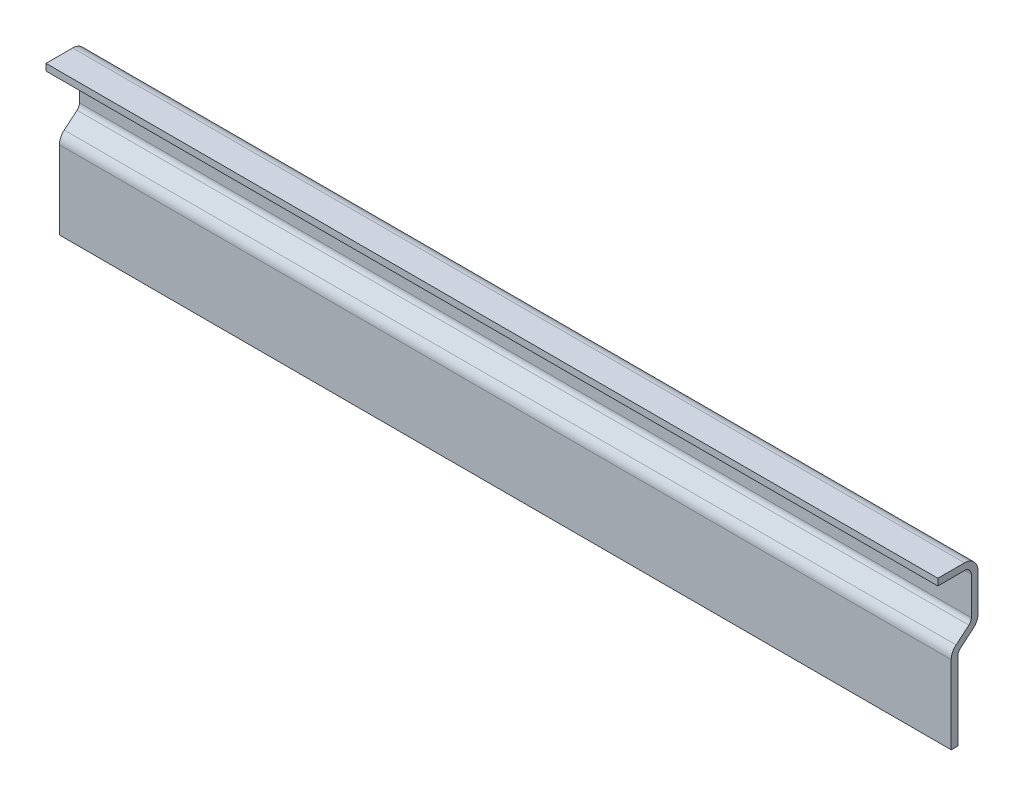
ISO-10303-21;
HEADER;
FILE_DESCRIPTION(('STEP AP214'),'2;1');
FILE_NAME('part.step','',(''),(''),'','','');
FILE_SCHEMA(('AUTOMOTIVE_DESIGN { 1 0 10303 214 1 1 1 1 }'));
ENDSEC;
DATA;
#1=APPLICATION_CONTEXT('core data for automotive mechanical design processes');
#2=APPLICATION_PROTOCOL_DEFINITION('international standard','automotive_design',2000,#1);
#3=PRODUCT_CONTEXT('',#1,'mechanical');
#4=PRODUCT('Part','Part','',(#3));
#5=PRODUCT_RELATED_PRODUCT_CATEGORY('part','',(#4));
#6=PRODUCT_DEFINITION_FORMATION('','',#4);
#7=PRODUCT_DEFINITION_CONTEXT('part definition',#1,'design');
#8=PRODUCT_DEFINITION('design','',#6,#7);
#9=PRODUCT_DEFINITION_SHAPE('','',#8);
#10=(LENGTH_UNIT() NAMED_UNIT(*) SI_UNIT(.MILLI.,.METRE.));
#11=(NAMED_UNIT(*) PLANE_ANGLE_UNIT() SI_UNIT($,.RADIAN.));
#12=(NAMED_UNIT(*) SI_UNIT($,.STERADIAN.) SOLID_ANGLE_UNIT());
#13=UNCERTAINTY_MEASURE_WITH_UNIT(LENGTH_MEASURE(1.E-05),#10,'distance_accuracy_value','');
#14=(GEOMETRIC_REPRESENTATION_CONTEXT(3) GLOBAL_UNCERTAINTY_ASSIGNED_CONTEXT((#13)) GLOBAL_UNIT_ASSIGNED_CONTEXT((#10,
#11,#12)) REPRESENTATION_CONTEXT('',''));
#15=CARTESIAN_POINT('',(0.,0.,0.));
#16=DIRECTION('',(0.,0.,1.));
#17=DIRECTION('',(1.,0.,0.));
#18=AXIS2_PLACEMENT_3D('',#15,#16,#17);
#19=CARTESIAN_POINT('',(-186.,-849.5,215.));
#20=DIRECTION('',(1.,0.,0.));
#21=DIRECTION('',(0.,0.,1.));
#22=AXIS2_PLACEMENT_3D('',#19,#20,#21);
#23=PLANE('',#22);
#24=DIRECTION('',(0.,0.,-1.));
#25=VECTOR('',#24,1.);
#26=CARTESIAN_POINT('',(-186.,-965.5,235.));
#27=LINE('',#26,#25);
#28=CARTESIAN_POINT('',(-186.,-965.5,235.));
#29=VERTEX_POINT('',#28);
#30=CARTESIAN_POINT('',(-186.,-965.5,230.));
#31=VERTEX_POINT('',#30);
#32=EDGE_CURVE('E100',#29,#31,#27,.T.);
#33=ORIENTED_EDGE('',*,*,#32,.F.);
#34=DIRECTION('',(0.,-1.,0.));
#35=VECTOR('',#34,1.);
#36=CARTESIAN_POINT('',(-186.,-907.17437087162,235.));
#37=LINE('',#36,#35);
#38=CARTESIAN_POINT('',(-186.,-907.17437087162,235.));
#39=VERTEX_POINT('',#38);
#40=EDGE_CURVE('E36',#39,#29,#37,.T.);
#41=ORIENTED_EDGE('',*,*,#40,.F.);
#42=CARTESIAN_POINT('',(-186.,-907.17437087162,224.9));
#43=DIRECTION('',(1.,0.,0.));
#44=DIRECTION('',(0.,0.766044443119007,0.642787609686505));
#45=AXIS2_PLACEMENT_3D('',#42,#43,#44);
#46=CIRCLE('',#45,10.1);
#47=CARTESIAN_POINT('',(-186.,-899.43732199611,231.39215485783));
#48=VERTEX_POINT('',#47);
#49=EDGE_CURVE('E241',#48,#39,#46,.T.);
#50=ORIENTED_EDGE('',*,*,#49,.F.);
#51=DIRECTION('',(0.,-0.642787609686505,0.766044443119007));
#52=VECTOR('',#51,1.);
#53=CARTESIAN_POINT('',(-186.,-891.40682665991,221.821783190599));
#54=LINE('',#53,#52);
#55=CARTESIAN_POINT('',(-186.,-891.40682665991,221.821783190599));
#56=VERTEX_POINT('',#55);
#57=EDGE_CURVE('E142',#56,#48,#54,.T.);
#58=ORIENTED_EDGE('',*,*,#57,.F.);
#59=CARTESIAN_POINT('',(-186.,-887.5,225.1));
#60=DIRECTION('',(-1.,0.,0.));
#61=DIRECTION('',(0.,0.,-1.));
#62=AXIS2_PLACEMENT_3D('',#59,#60,#61);
#63=CIRCLE('',#62,5.1);
#64=CARTESIAN_POINT('',(-186.,-887.5,220.));
#65=VERTEX_POINT('',#64);
#66=EDGE_CURVE('E139',#65,#56,#63,.T.);
#67=ORIENTED_EDGE('',*,*,#66,.F.);
#68=DIRECTION('',(0.,-1.,0.));
#69=VECTOR('',#68,1.);
#70=CARTESIAN_POINT('',(-186.,-859.6,220.));
#71=LINE('',#70,#69);
#72=CARTESIAN_POINT('',(-186.,-859.6,220.));
#73=VERTEX_POINT('',#72);
#74=EDGE_CURVE('E127',#73,#65,#71,.T.);
#75=ORIENTED_EDGE('',*,*,#74,.F.);
#76=CARTESIAN_POINT('',(-186.,-859.6,225.1));
#77=DIRECTION('',(-1.,0.,0.));
#78=DIRECTION('',(0.,1.,0.));
#79=AXIS2_PLACEMENT_3D('',#76,#77,#78);
#80=CIRCLE('',#79,5.1);
#81=CARTESIAN_POINT('',(-186.,-854.5,225.1));
#82=VERTEX_POINT('',#81);
#83=EDGE_CURVE('E207',#82,#73,#80,.T.);
#84=ORIENTED_EDGE('',*,*,#83,.F.);
#85=DIRECTION('',(0.,0.,-1.));
#86=VECTOR('',#85,1.);
#87=CARTESIAN_POINT('',(-186.,-854.5,245.));
#88=LINE('',#87,#86);
#89=CARTESIAN_POINT('',(-186.,-854.5,245.));
#90=VERTEX_POINT('',#89);
#91=EDGE_CURVE('E204',#90,#82,#88,.T.);
#92=ORIENTED_EDGE('',*,*,#91,.F.);
#93=DIRECTION('',(0.,-1.,0.));
#94=VECTOR('',#93,1.);
#95=CARTESIAN_POINT('',(-186.,-849.5,245.));
#96=LINE('',#95,#94);
#97=CARTESIAN_POINT('',(-186.,-849.5,245.));
#98=VERTEX_POINT('',#97);
#99=EDGE_CURVE('E163',#98,#90,#96,.T.);
#100=ORIENTED_EDGE('',*,*,#99,.F.);
#101=DIRECTION('',(0.,0.,1.));
#102=VECTOR('',#101,1.);
#103=CARTESIAN_POINT('',(-186.,-849.5,225.1));
#104=LINE('',#103,#102);
#105=CARTESIAN_POINT('',(-186.,-849.5,225.1));
#106=VERTEX_POINT('',#105);
#107=EDGE_CURVE('E155',#106,#98,#104,.T.);
#108=ORIENTED_EDGE('',*,*,#107,.F.);
#109=CARTESIAN_POINT('',(-186.,-859.6,225.1));
#110=DIRECTION('',(1.,0.,0.));
#111=DIRECTION('',(0.,0.,-1.));
#112=AXIS2_PLACEMENT_3D('',#109,#110,#111);
#113=CIRCLE('',#112,10.1);
#114=CARTESIAN_POINT('',(-186.,-859.6,215.));
#115=VERTEX_POINT('',#114);
#116=EDGE_CURVE('E157',#115,#106,#113,.T.);
#117=ORIENTED_EDGE('',*,*,#116,.F.);
#118=DIRECTION('',(0.,1.,0.));
#119=VECTOR('',#118,1.);
#120=CARTESIAN_POINT('',(-186.,-887.5,215.));
#121=LINE('',#120,#119);
#122=CARTESIAN_POINT('',(-186.,-887.5,215.));
#123=VERTEX_POINT('',#122);
#124=EDGE_CURVE('E167',#123,#115,#121,.T.);
#125=ORIENTED_EDGE('',*,*,#124,.F.);
#126=CARTESIAN_POINT('',(-186.,-887.5,225.1));
#127=DIRECTION('',(1.,0.,0.));
#128=DIRECTION('',(0.,-0.766044443119007,-0.642787609686505));
#129=AXIS2_PLACEMENT_3D('',#126,#127,#128);
#130=CIRCLE('',#129,10.1);
#131=CARTESIAN_POINT('',(-186.,-895.2370488755,218.607845142166));
#132=VERTEX_POINT('',#131);
#133=EDGE_CURVE('E199',#132,#123,#130,.T.);
#134=ORIENTED_EDGE('',*,*,#133,.F.);
#135=DIRECTION('',(0.,0.642787609686505,-0.766044443119007));
#136=VECTOR('',#135,1.);
#137=CARTESIAN_POINT('',(-186.,-903.26754421171,228.1782168094));
#138=LINE('',#137,#136);
#139=CARTESIAN_POINT('',(-186.,-903.26754421171,228.1782168094));
#140=VERTEX_POINT('',#139);
#141=EDGE_CURVE('E255',#140,#132,#138,.T.);
#142=ORIENTED_EDGE('',*,*,#141,.F.);
#143=CARTESIAN_POINT('',(-186.,-907.17437087162,224.9));
#144=DIRECTION('',(-1.,0.,0.));
#145=DIRECTION('',(0.,0.,1.));
#146=AXIS2_PLACEMENT_3D('',#143,#144,#145);
#147=CIRCLE('',#146,5.1);
#148=CARTESIAN_POINT('',(-186.,-907.17437087162,230.));
#149=VERTEX_POINT('',#148);
#150=EDGE_CURVE('E175',#149,#140,#147,.T.);
#151=ORIENTED_EDGE('',*,*,#150,.F.);
#152=DIRECTION('',(0.,1.,0.));
#153=VECTOR('',#152,1.);
#154=CARTESIAN_POINT('',(-186.,-965.5,230.));
#155=LINE('',#154,#153);
#156=EDGE_CURVE('E27',#31,#149,#155,.T.);
#157=ORIENTED_EDGE('',*,*,#156,.F.);
#158=EDGE_LOOP('',(#33,#41,#50,#58,#67,#75,#84,#92,#100,#108,#117,#125,#134,#142,#151,#157));
#159=FACE_BOUND('',#158,.T.);
#160=ADVANCED_FACE('F17',(#159),#23,.F.);
#161=CARTESIAN_POINT('',(-186.,-965.5,230.));
#162=DIRECTION('',(0.,0.,-1.));
#163=DIRECTION('',(0.,1.,0.));
#164=AXIS2_PLACEMENT_3D('',#161,#162,#163);
#165=PLANE('',#164);
#166=DIRECTION('',(1.,0.,0.));
#167=VECTOR('',#166,1.);
#168=CARTESIAN_POINT('',(-186.,-907.17437087162,230.));
#169=LINE('',#168,#167);
#170=CARTESIAN_POINT('',(480.,-907.17437087162,230.));
#171=VERTEX_POINT('',#170);
#172=EDGE_CURVE('E11',#149,#171,#169,.T.);
#173=ORIENTED_EDGE('',*,*,#172,.T.);
#174=DIRECTION('',(0.,1.,0.));
#175=VECTOR('',#174,1.);
#176=CARTESIAN_POINT('',(480.,-965.5,230.));
#177=LINE('',#176,#175);
#178=CARTESIAN_POINT('',(480.,-965.5,230.));
#179=VERTEX_POINT('',#178);
#180=EDGE_CURVE('E107',#179,#171,#177,.T.);
#181=ORIENTED_EDGE('',*,*,#180,.F.);
#182=DIRECTION('',(1.,0.,0.));
#183=VECTOR('',#182,1.);
#184=CARTESIAN_POINT('',(-186.,-965.5,230.));
#185=LINE('',#184,#183);
#186=EDGE_CURVE('E246',#31,#179,#185,.T.);
#187=ORIENTED_EDGE('',*,*,#186,.F.);
#188=ORIENTED_EDGE('',*,*,#156,.T.);
#189=EDGE_LOOP('',(#173,#181,#187,#188));
#190=FACE_BOUND('',#189,.T.);
#191=ADVANCED_FACE('F297',(#190),#165,.T.);
#192=CARTESIAN_POINT('',(-186.,-965.5,235.));
#193=DIRECTION('',(0.,-1.,0.));
#194=DIRECTION('',(1.,0.,0.));
#195=AXIS2_PLACEMENT_3D('',#192,#193,#194);
#196=PLANE('',#195);
#197=ORIENTED_EDGE('',*,*,#186,.T.);
#198=DIRECTION('',(0.,0.,-1.));
#199=VECTOR('',#198,1.);
#200=CARTESIAN_POINT('',(480.,-965.5,235.));
#201=LINE('',#200,#199);
#202=CARTESIAN_POINT('',(480.,-965.5,235.));
#203=VERTEX_POINT('',#202);
#204=EDGE_CURVE('E188',#203,#179,#201,.T.);
#205=ORIENTED_EDGE('',*,*,#204,.F.);
#206=DIRECTION('',(1.,0.,0.));
#207=VECTOR('',#206,1.);
#208=CARTESIAN_POINT('',(-186.,-965.5,235.));
#209=LINE('',#208,#207);
#210=EDGE_CURVE('E205',#29,#203,#209,.T.);
#211=ORIENTED_EDGE('',*,*,#210,.F.);
#212=ORIENTED_EDGE('',*,*,#32,.T.);
#213=EDGE_LOOP('',(#197,#205,#211,#212));
#214=FACE_BOUND('',#213,.T.);
#215=ADVANCED_FACE('F19',(#214),#196,.T.);
#216=CARTESIAN_POINT('',(-186.,-907.17437087162,235.));
#217=DIRECTION('',(0.,0.,1.));
#218=DIRECTION('',(1.,0.,0.));
#219=AXIS2_PLACEMENT_3D('',#216,#217,#218);
#220=PLANE('',#219);
#221=ORIENTED_EDGE('',*,*,#210,.T.);
#222=DIRECTION('',(0.,-1.,0.));
#223=VECTOR('',#222,1.);
#224=CARTESIAN_POINT('',(480.,-907.17437087162,235.));
#225=LINE('',#224,#223);
#226=CARTESIAN_POINT('',(480.,-907.17437087162,235.));
#227=VERTEX_POINT('',#226);
#228=EDGE_CURVE('E189',#227,#203,#225,.T.);
#229=ORIENTED_EDGE('',*,*,#228,.F.);
#230=DIRECTION('',(1.,0.,0.));
#231=VECTOR('',#230,1.);
#232=CARTESIAN_POINT('',(-186.,-907.17437087162,235.));
#233=LINE('',#232,#231);
#234=EDGE_CURVE('E242',#39,#227,#233,.T.);
#235=ORIENTED_EDGE('',*,*,#234,.F.);
#236=ORIENTED_EDGE('',*,*,#40,.T.);
#237=EDGE_LOOP('',(#221,#229,#235,#236));
#238=FACE_BOUND('',#237,.T.);
#239=ADVANCED_FACE('F289',(#238),#220,.T.);
#240=CARTESIAN_POINT('',(-186.,-907.17437087162,224.9));
#241=DIRECTION('',(1.,0.,0.));
#242=DIRECTION('',(0.,1.,0.));
#243=AXIS2_PLACEMENT_3D('',#240,#241,#242);
#244=CYLINDRICAL_SURFACE('',#243,10.1);
#245=ORIENTED_EDGE('',*,*,#234,.T.);
#246=CARTESIAN_POINT('',(480.,-907.17437087162,224.9));
#247=DIRECTION('',(1.,0.,0.));
#248=DIRECTION('',(0.,0.766044443119007,0.642787609686505));
#249=AXIS2_PLACEMENT_3D('',#246,#247,#248);
#250=CIRCLE('',#249,10.1);
#251=CARTESIAN_POINT('',(480.,-899.43732199611,231.39215485783));
#252=VERTEX_POINT('',#251);
#253=EDGE_CURVE('E192',#252,#227,#250,.T.);
#254=ORIENTED_EDGE('',*,*,#253,.F.);
#255=DIRECTION('',(1.,0.,0.));
#256=VECTOR('',#255,1.);
#257=CARTESIAN_POINT('',(-186.,-899.43732199611,231.39215485783));
#258=LINE('',#257,#256);
#259=EDGE_CURVE('E196',#48,#252,#258,.T.);
#260=ORIENTED_EDGE('',*,*,#259,.F.);
#261=ORIENTED_EDGE('',*,*,#49,.T.);
#262=EDGE_LOOP('',(#245,#254,#260,#261));
#263=FACE_BOUND('',#262,.T.);
#264=ADVANCED_FACE('F291',(#263),#244,.T.);
#265=CARTESIAN_POINT('',(-186.,-891.40682665991,221.821783190599));
#266=DIRECTION('',(0.,0.766044443119007,0.642787609686505));
#267=DIRECTION('',(-1.,0.,0.));
#268=AXIS2_PLACEMENT_3D('',#265,#266,#267);
#269=PLANE('',#268);
#270=ORIENTED_EDGE('',*,*,#259,.T.);
#271=DIRECTION('',(0.,-0.642787609686505,0.766044443119007));
#272=VECTOR('',#271,1.);
#273=CARTESIAN_POINT('',(480.,-891.40682665991,221.821783190599));
#274=LINE('',#273,#272);
#275=CARTESIAN_POINT('',(480.,-891.40682665991,221.821783190599));
#276=VERTEX_POINT('',#275);
#277=EDGE_CURVE('E174',#276,#252,#274,.T.);
#278=ORIENTED_EDGE('',*,*,#277,.F.);
#279=DIRECTION('',(1.,0.,0.));
#280=VECTOR('',#279,1.);
#281=CARTESIAN_POINT('',(-186.,-891.40682665991,221.821783190599));
#282=LINE('',#281,#280);
#283=EDGE_CURVE('E146',#56,#276,#282,.T.);
#284=ORIENTED_EDGE('',*,*,#283,.F.);
#285=ORIENTED_EDGE('',*,*,#57,.T.);
#286=EDGE_LOOP('',(#270,#278,#284,#285));
#287=FACE_BOUND('',#286,.T.);
#288=ADVANCED_FACE('F294',(#287),#269,.T.);
#289=CARTESIAN_POINT('',(-186.,-887.5,225.1));
#290=DIRECTION('',(1.,0.,0.));
#291=DIRECTION('',(0.,1.,0.));
#292=AXIS2_PLACEMENT_3D('',#289,#290,#291);
#293=CYLINDRICAL_SURFACE('',#292,5.1);
#294=ORIENTED_EDGE('',*,*,#283,.T.);
#295=CARTESIAN_POINT('',(480.,-887.5,225.1));
#296=DIRECTION('',(-1.,0.,0.));
#297=DIRECTION('',(0.,0.,-1.));
#298=AXIS2_PLACEMENT_3D('',#295,#296,#297);
#299=CIRCLE('',#298,5.1);
#300=CARTESIAN_POINT('',(480.,-887.5,220.));
#301=VERTEX_POINT('',#300);
#302=EDGE_CURVE('E151',#301,#276,#299,.T.);
#303=ORIENTED_EDGE('',*,*,#302,.F.);
#304=DIRECTION('',(1.,0.,0.));
#305=VECTOR('',#304,1.);
#306=CARTESIAN_POINT('',(-186.,-887.5,220.));
#307=LINE('',#306,#305);
#308=EDGE_CURVE('E131',#65,#301,#307,.T.);
#309=ORIENTED_EDGE('',*,*,#308,.F.);
#310=ORIENTED_EDGE('',*,*,#66,.T.);
#311=EDGE_LOOP('',(#294,#303,#309,#310));
#312=FACE_BOUND('',#311,.T.);
#313=ADVANCED_FACE('F149',(#312),#293,.F.);
#314=CARTESIAN_POINT('',(-186.,-859.6,220.));
#315=DIRECTION('',(0.,0.,1.));
#316=DIRECTION('',(1.,0.,0.));
#317=AXIS2_PLACEMENT_3D('',#314,#315,#316);
#318=PLANE('',#317);
#319=ORIENTED_EDGE('',*,*,#308,.T.);
#320=DIRECTION('',(0.,-1.,0.));
#321=VECTOR('',#320,1.);
#322=CARTESIAN_POINT('',(480.,-859.6,220.));
#323=LINE('',#322,#321);
#324=CARTESIAN_POINT('',(480.,-859.6,220.));
#325=VERTEX_POINT('',#324);
#326=EDGE_CURVE('E170',#325,#301,#323,.T.);
#327=ORIENTED_EDGE('',*,*,#326,.F.);
#328=DIRECTION('',(1.,0.,0.));
#329=VECTOR('',#328,1.);
#330=CARTESIAN_POINT('',(-186.,-859.6,220.));
#331=LINE('',#330,#329);
#332=EDGE_CURVE('E134',#73,#325,#331,.T.);
#333=ORIENTED_EDGE('',*,*,#332,.F.);
#334=ORIENTED_EDGE('',*,*,#74,.T.);
#335=EDGE_LOOP('',(#319,#327,#333,#334));
#336=FACE_BOUND('',#335,.T.);
#337=ADVANCED_FACE('F129',(#336),#318,.T.);
#338=CARTESIAN_POINT('',(-186.,-859.6,225.1));
#339=DIRECTION('',(1.,0.,0.));
#340=DIRECTION('',(0.,1.,0.));
#341=AXIS2_PLACEMENT_3D('',#338,#339,#340);
#342=CYLINDRICAL_SURFACE('',#341,5.1);
#343=ORIENTED_EDGE('',*,*,#332,.T.);
#344=CARTESIAN_POINT('',(480.,-859.6,225.1));
#345=DIRECTION('',(-1.,0.,0.));
#346=DIRECTION('',(0.,1.,0.));
#347=AXIS2_PLACEMENT_3D('',#344,#345,#346);
#348=CIRCLE('',#347,5.1);
#349=CARTESIAN_POINT('',(480.,-854.5,225.1));
#350=VERTEX_POINT('',#349);
#351=EDGE_CURVE('E172',#350,#325,#348,.T.);
#352=ORIENTED_EDGE('',*,*,#351,.F.);
#353=DIRECTION('',(1.,0.,0.));
#354=VECTOR('',#353,1.);
#355=CARTESIAN_POINT('',(-186.,-854.5,225.1));
#356=LINE('',#355,#354);
#357=EDGE_CURVE('E235',#82,#350,#356,.T.);
#358=ORIENTED_EDGE('',*,*,#357,.F.);
#359=ORIENTED_EDGE('',*,*,#83,.T.);
#360=EDGE_LOOP('',(#343,#352,#358,#359));
#361=FACE_BOUND('',#360,.T.);
#362=ADVANCED_FACE('F320',(#361),#342,.F.);
#363=CARTESIAN_POINT('',(-186.,-854.5,245.));
#364=DIRECTION('',(0.,-1.,0.));
#365=DIRECTION('',(1.,0.,0.));
#366=AXIS2_PLACEMENT_3D('',#363,#364,#365);
#367=PLANE('',#366);
#368=ORIENTED_EDGE('',*,*,#357,.T.);
#369=DIRECTION('',(0.,0.,-1.));
#370=VECTOR('',#369,1.);
#371=CARTESIAN_POINT('',(480.,-854.5,245.));
#372=LINE('',#371,#370);
#373=CARTESIAN_POINT('',(480.,-854.5,245.));
#374=VERTEX_POINT('',#373);
#375=EDGE_CURVE('E182',#374,#350,#372,.T.);
#376=ORIENTED_EDGE('',*,*,#375,.F.);
#377=DIRECTION('',(1.,0.,0.));
#378=VECTOR('',#377,1.);
#379=CARTESIAN_POINT('',(-186.,-854.5,245.));
#380=LINE('',#379,#378);
#381=EDGE_CURVE('E164',#90,#374,#380,.T.);
#382=ORIENTED_EDGE('',*,*,#381,.F.);
#383=ORIENTED_EDGE('',*,*,#91,.T.);
#384=EDGE_LOOP('',(#368,#376,#382,#383));
#385=FACE_BOUND('',#384,.T.);
#386=ADVANCED_FACE('F233',(#385),#367,.T.);
#387=CARTESIAN_POINT('',(-186.,-849.5,245.));
#388=DIRECTION('',(0.,0.,1.));
#389=DIRECTION('',(1.,0.,0.));
#390=AXIS2_PLACEMENT_3D('',#387,#388,#389);
#391=PLANE('',#390);
#392=ORIENTED_EDGE('',*,*,#381,.T.);
#393=DIRECTION('',(0.,-1.,0.));
#394=VECTOR('',#393,1.);
#395=CARTESIAN_POINT('',(480.,-849.5,245.));
#396=LINE('',#395,#394);
#397=CARTESIAN_POINT('',(480.,-849.5,245.));
#398=VERTEX_POINT('',#397);
#399=EDGE_CURVE('E178',#398,#374,#396,.T.);
#400=ORIENTED_EDGE('',*,*,#399,.F.);
#401=DIRECTION('',(1.,0.,0.));
#402=VECTOR('',#401,1.);
#403=CARTESIAN_POINT('',(-186.,-849.5,245.));
#404=LINE('',#403,#402);
#405=EDGE_CURVE('E165',#98,#398,#404,.T.);
#406=ORIENTED_EDGE('',*,*,#405,.F.);
#407=ORIENTED_EDGE('',*,*,#99,.T.);
#408=EDGE_LOOP('',(#392,#400,#406,#407));
#409=FACE_BOUND('',#408,.T.);
#410=ADVANCED_FACE('F228',(#409),#391,.T.);
#411=CARTESIAN_POINT('',(-186.,-849.5,225.1));
#412=DIRECTION('',(0.,1.,0.));
#413=DIRECTION('',(0.,0.,-1.));
#414=AXIS2_PLACEMENT_3D('',#411,#412,#413);
#415=PLANE('',#414);
#416=ORIENTED_EDGE('',*,*,#405,.T.);
#417=DIRECTION('',(0.,0.,1.));
#418=VECTOR('',#417,1.);
#419=CARTESIAN_POINT('',(480.,-849.5,225.1));
#420=LINE('',#419,#418);
#421=CARTESIAN_POINT('',(480.,-849.5,225.1));
#422=VERTEX_POINT('',#421);
#423=EDGE_CURVE('E181',#422,#398,#420,.T.);
#424=ORIENTED_EDGE('',*,*,#423,.F.);
#425=DIRECTION('',(1.,0.,0.));
#426=VECTOR('',#425,1.);
#427=CARTESIAN_POINT('',(-186.,-849.5,225.1));
#428=LINE('',#427,#426);
#429=EDGE_CURVE('E159',#106,#422,#428,.T.);
#430=ORIENTED_EDGE('',*,*,#429,.F.);
#431=ORIENTED_EDGE('',*,*,#107,.T.);
#432=EDGE_LOOP('',(#416,#424,#430,#431));
#433=FACE_BOUND('',#432,.T.);
#434=ADVANCED_FACE('F214',(#433),#415,.T.);
#435=CARTESIAN_POINT('',(-186.,-859.6,225.1));
#436=DIRECTION('',(1.,0.,0.));
#437=DIRECTION('',(0.,1.,0.));
#438=AXIS2_PLACEMENT_3D('',#435,#436,#437);
#439=CYLINDRICAL_SURFACE('',#438,10.1);
#440=ORIENTED_EDGE('',*,*,#429,.T.);
#441=CARTESIAN_POINT('',(480.,-859.6,225.1));
#442=DIRECTION('',(1.,0.,0.));
#443=DIRECTION('',(0.,0.,-1.));
#444=AXIS2_PLACEMENT_3D('',#441,#442,#443);
#445=CIRCLE('',#444,10.1);
#446=CARTESIAN_POINT('',(480.,-859.6,215.));
#447=VERTEX_POINT('',#446);
#448=EDGE_CURVE('E183',#447,#422,#445,.T.);
#449=ORIENTED_EDGE('',*,*,#448,.F.);
#450=DIRECTION('',(1.,0.,0.));
#451=VECTOR('',#450,1.);
#452=CARTESIAN_POINT('',(-186.,-859.6,215.));
#453=LINE('',#452,#451);
#454=EDGE_CURVE('E160',#115,#447,#453,.T.);
#455=ORIENTED_EDGE('',*,*,#454,.F.);
#456=ORIENTED_EDGE('',*,*,#116,.T.);
#457=EDGE_LOOP('',(#440,#449,#455,#456));
#458=FACE_BOUND('',#457,.T.);
#459=ADVANCED_FACE('F217',(#458),#439,.T.);
#460=CARTESIAN_POINT('',(-186.,-887.5,215.));
#461=DIRECTION('',(0.,0.,-1.));
#462=DIRECTION('',(0.,1.,0.));
#463=AXIS2_PLACEMENT_3D('',#460,#461,#462);
#464=PLANE('',#463);
#465=ORIENTED_EDGE('',*,*,#454,.T.);
#466=DIRECTION('',(0.,1.,0.));
#467=VECTOR('',#466,1.);
#468=CARTESIAN_POINT('',(480.,-887.5,215.));
#469=LINE('',#468,#467);
#470=CARTESIAN_POINT('',(480.,-887.5,215.));
#471=VERTEX_POINT('',#470);
#472=EDGE_CURVE('E186',#471,#447,#469,.T.);
#473=ORIENTED_EDGE('',*,*,#472,.F.);
#474=DIRECTION('',(1.,0.,0.));
#475=VECTOR('',#474,1.);
#476=CARTESIAN_POINT('',(-186.,-887.5,215.));
#477=LINE('',#476,#475);
#478=EDGE_CURVE('E169',#123,#471,#477,.T.);
#479=ORIENTED_EDGE('',*,*,#478,.F.);
#480=ORIENTED_EDGE('',*,*,#124,.T.);
#481=EDGE_LOOP('',(#465,#473,#479,#480));
#482=FACE_BOUND('',#481,.T.);
#483=ADVANCED_FACE('F328',(#482),#464,.T.);
#484=CARTESIAN_POINT('',(-186.,-887.5,225.1));
#485=DIRECTION('',(1.,0.,0.));
#486=DIRECTION('',(0.,1.,0.));
#487=AXIS2_PLACEMENT_3D('',#484,#485,#486);
#488=CYLINDRICAL_SURFACE('',#487,10.1);
#489=ORIENTED_EDGE('',*,*,#478,.T.);
#490=CARTESIAN_POINT('',(480.,-887.5,225.1));
#491=DIRECTION('',(1.,0.,0.));
#492=DIRECTION('',(0.,-0.766044443119007,-0.642787609686505));
#493=AXIS2_PLACEMENT_3D('',#490,#491,#492);
#494=CIRCLE('',#493,10.1);
#495=CARTESIAN_POINT('',(480.,-895.2370488755,218.607845142166));
#496=VERTEX_POINT('',#495);
#497=EDGE_CURVE('E249',#496,#471,#494,.T.);
#498=ORIENTED_EDGE('',*,*,#497,.F.);
#499=DIRECTION('',(1.,0.,0.));
#500=VECTOR('',#499,1.);
#501=CARTESIAN_POINT('',(-186.,-895.2370488755,218.607845142166));
#502=LINE('',#501,#500);
#503=EDGE_CURVE('E258',#132,#496,#502,.T.);
#504=ORIENTED_EDGE('',*,*,#503,.F.);
#505=ORIENTED_EDGE('',*,*,#133,.T.);
#506=EDGE_LOOP('',(#489,#498,#504,#505));
#507=FACE_BOUND('',#506,.T.);
#508=ADVANCED_FACE('F278',(#507),#488,.T.);
#509=CARTESIAN_POINT('',(-186.,-903.26754421171,228.1782168094));
#510=DIRECTION('',(0.,-0.766044443119007,-0.642787609686505));
#511=DIRECTION('',(-1.,0.,0.));
#512=AXIS2_PLACEMENT_3D('',#509,#510,#511);
#513=PLANE('',#512);
#514=ORIENTED_EDGE('',*,*,#503,.T.);
#515=DIRECTION('',(0.,0.642787609686505,-0.766044443119007));
#516=VECTOR('',#515,1.);
#517=CARTESIAN_POINT('',(480.,-903.26754421171,228.1782168094));
#518=LINE('',#517,#516);
#519=CARTESIAN_POINT('',(480.,-903.26754421171,228.1782168094));
#520=VERTEX_POINT('',#519);
#521=EDGE_CURVE('E250',#520,#496,#518,.T.);
#522=ORIENTED_EDGE('',*,*,#521,.F.);
#523=DIRECTION('',(1.,0.,0.));
#524=VECTOR('',#523,1.);
#525=CARTESIAN_POINT('',(-186.,-903.26754421171,228.1782168094));
#526=LINE('',#525,#524);
#527=EDGE_CURVE('E177',#140,#520,#526,.T.);
#528=ORIENTED_EDGE('',*,*,#527,.F.);
#529=ORIENTED_EDGE('',*,*,#141,.T.);
#530=EDGE_LOOP('',(#514,#522,#528,#529));
#531=FACE_BOUND('',#530,.T.);
#532=ADVANCED_FACE('F271',(#531),#513,.T.);
#533=CARTESIAN_POINT('',(-186.,-907.17437087162,224.9));
#534=DIRECTION('',(1.,0.,0.));
#535=DIRECTION('',(0.,1.,0.));
#536=AXIS2_PLACEMENT_3D('',#533,#534,#535);
#537=CYLINDRICAL_SURFACE('',#536,5.1);
#538=ORIENTED_EDGE('',*,*,#527,.T.);
#539=CARTESIAN_POINT('',(480.,-907.17437087162,224.9));
#540=DIRECTION('',(-1.,0.,0.));
#541=DIRECTION('',(0.,0.,1.));
#542=AXIS2_PLACEMENT_3D('',#539,#540,#541);
#543=CIRCLE('',#542,5.1);
#544=EDGE_CURVE('E21',#171,#520,#543,.T.);
#545=ORIENTED_EDGE('',*,*,#544,.F.);
#546=ORIENTED_EDGE('',*,*,#172,.F.);
#547=ORIENTED_EDGE('',*,*,#150,.T.);
#548=EDGE_LOOP('',(#538,#545,#546,#547));
#549=FACE_BOUND('',#548,.T.);
#550=ADVANCED_FACE('F300',(#549),#537,.F.);
#551=CARTESIAN_POINT('',(480.,-849.5,215.));
#552=DIRECTION('',(1.,0.,0.));
#553=DIRECTION('',(0.,0.,1.));
#554=AXIS2_PLACEMENT_3D('',#551,#552,#553);
#555=PLANE('',#554);
#556=ORIENTED_EDGE('',*,*,#544,.T.);
#557=ORIENTED_EDGE('',*,*,#521,.T.);
#558=ORIENTED_EDGE('',*,*,#497,.T.);
#559=ORIENTED_EDGE('',*,*,#472,.T.);
#560=ORIENTED_EDGE('',*,*,#448,.T.);
#561=ORIENTED_EDGE('',*,*,#423,.T.);
#562=ORIENTED_EDGE('',*,*,#399,.T.);
#563=ORIENTED_EDGE('',*,*,#375,.T.);
#564=ORIENTED_EDGE('',*,*,#351,.T.);
#565=ORIENTED_EDGE('',*,*,#326,.T.);
#566=ORIENTED_EDGE('',*,*,#302,.T.);
#567=ORIENTED_EDGE('',*,*,#277,.T.);
#568=ORIENTED_EDGE('',*,*,#253,.T.);
#569=ORIENTED_EDGE('',*,*,#228,.T.);
#570=ORIENTED_EDGE('',*,*,#204,.T.);
#571=ORIENTED_EDGE('',*,*,#180,.T.);
#572=EDGE_LOOP('',(#556,#557,#558,#559,#560,#561,#562,#563,#564,#565,#566,#567,#568,#569,#570,#571));
#573=FACE_BOUND('',#572,.T.);
#574=ADVANCED_FACE('F209',(#573),#555,.T.);
#575=CLOSED_SHELL('',(#160,#191,#215,#239,#264,#288,#313,#337,#362,#386,#410,#434,#459,#483,
#508,#532,#550,#574));
#576=MANIFOLD_SOLID_BREP('B1',#575);
#577=ADVANCED_BREP_SHAPE_REPRESENTATION('',(#18,#576),#14);
#578=SHAPE_DEFINITION_REPRESENTATION(#9,#577);
ENDSEC;
END-ISO-10303-21;
